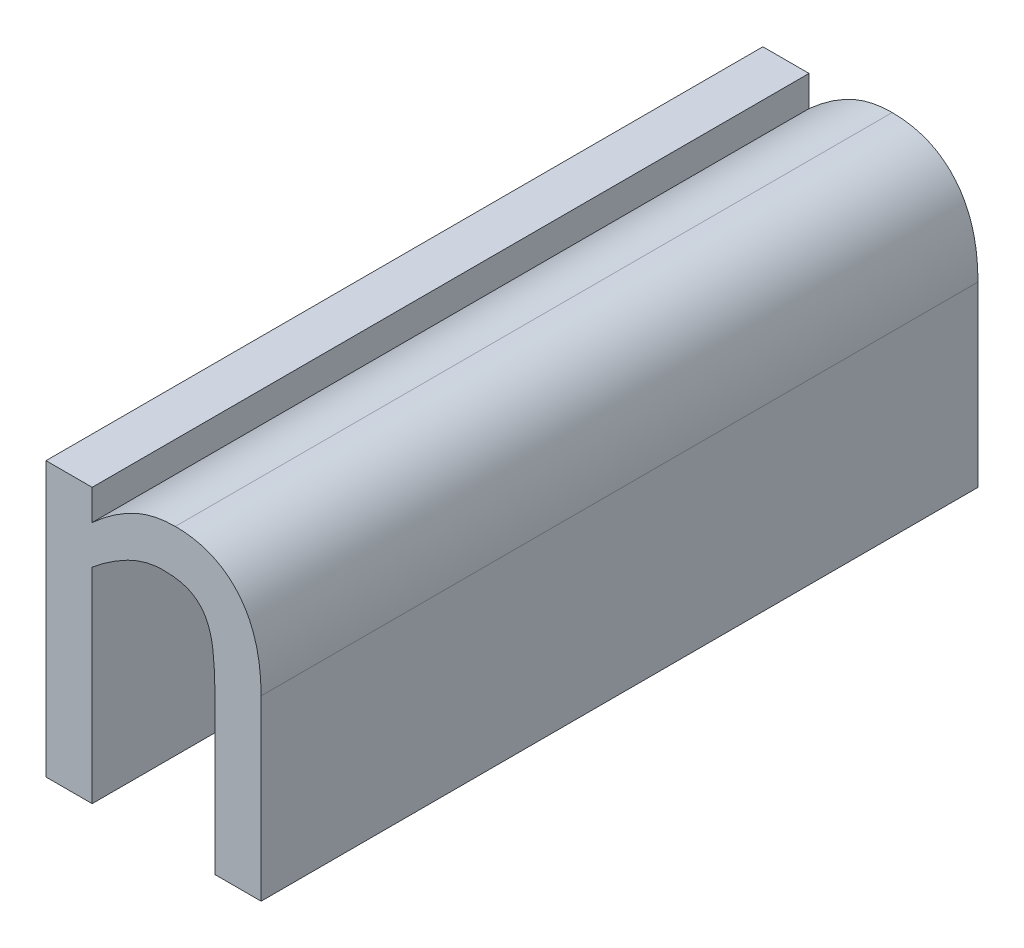
ISO-10303-21;
HEADER;
FILE_DESCRIPTION(('STEP AP214'),'2;1');
FILE_NAME('part.step','',(''),(''),'','','');
FILE_SCHEMA(('AUTOMOTIVE_DESIGN { 1 0 10303 214 1 1 1 1 }'));
ENDSEC;
DATA;
#1=APPLICATION_CONTEXT('core data for automotive mechanical design processes');
#2=APPLICATION_PROTOCOL_DEFINITION('international standard','automotive_design',2000,#1);
#3=PRODUCT_CONTEXT('',#1,'mechanical');
#4=PRODUCT('Part','Part','',(#3));
#5=PRODUCT_RELATED_PRODUCT_CATEGORY('part','',(#4));
#6=PRODUCT_DEFINITION_FORMATION('','',#4);
#7=PRODUCT_DEFINITION_CONTEXT('part definition',#1,'design');
#8=PRODUCT_DEFINITION('design','',#6,#7);
#9=PRODUCT_DEFINITION_SHAPE('','',#8);
#10=(LENGTH_UNIT() NAMED_UNIT(*) SI_UNIT(.MILLI.,.METRE.));
#11=(NAMED_UNIT(*) PLANE_ANGLE_UNIT() SI_UNIT($,.RADIAN.));
#12=(NAMED_UNIT(*) SI_UNIT($,.STERADIAN.) SOLID_ANGLE_UNIT());
#13=UNCERTAINTY_MEASURE_WITH_UNIT(LENGTH_MEASURE(1.E-05),#10,'distance_accuracy_value','');
#14=(GEOMETRIC_REPRESENTATION_CONTEXT(3) GLOBAL_UNCERTAINTY_ASSIGNED_CONTEXT((#13)) GLOBAL_UNIT_ASSIGNED_CONTEXT((#10,
#11,#12)) REPRESENTATION_CONTEXT('',''));
#15=CARTESIAN_POINT('',(0.,0.,0.));
#16=DIRECTION('',(0.,0.,1.));
#17=DIRECTION('',(1.,0.,0.));
#18=AXIS2_PLACEMENT_3D('',#15,#16,#17);
#19=CARTESIAN_POINT('',(-1.705287300423,-1.884092758713,0.));
#20=DIRECTION('',(-1.,0.,0.));
#21=DIRECTION('',(0.,-1.,0.));
#22=AXIS2_PLACEMENT_3D('',#19,#20,#21);
#23=PLANE('',#22);
#24=DIRECTION('',(0.,1.,0.));
#25=VECTOR('',#24,1.);
#26=CARTESIAN_POINT('',(-1.705287300423,-1.905886879973,0.));
#27=LINE('',#26,#25);
#28=CARTESIAN_POINT('',(-1.705287300423,-1.905886879973,0.));
#29=VERTEX_POINT('',#28);
#30=CARTESIAN_POINT('',(-1.705287300423,-1.884092758713,0.));
#31=VERTEX_POINT('',#30);
#32=EDGE_CURVE('E11',#29,#31,#27,.T.);
#33=ORIENTED_EDGE('',*,*,#32,.F.);
#34=DIRECTION('',(0.,0.,1.));
#35=VECTOR('',#34,1.);
#36=CARTESIAN_POINT('',(-1.705287300423,-1.905886879973,0.));
#37=LINE('',#36,#35);
#38=CARTESIAN_POINT('',(-1.705287300423,-1.905886879973,0.1));
#39=VERTEX_POINT('',#38);
#40=EDGE_CURVE('E24',#29,#39,#37,.T.);
#41=ORIENTED_EDGE('',*,*,#40,.T.);
#42=DIRECTION('',(0.,-1.,0.));
#43=VECTOR('',#42,1.);
#44=CARTESIAN_POINT('',(-1.705287300423,-1.905886879973,0.1));
#45=LINE('',#44,#43);
#46=CARTESIAN_POINT('',(-1.705287300423,-1.884092758713,0.1));
#47=VERTEX_POINT('',#46);
#48=EDGE_CURVE('E130',#47,#39,#45,.T.);
#49=ORIENTED_EDGE('',*,*,#48,.F.);
#50=DIRECTION('',(0.,0.,1.));
#51=VECTOR('',#50,1.);
#52=CARTESIAN_POINT('',(-1.705287300423,-1.884092758713,0.));
#53=LINE('',#52,#51);
#54=EDGE_CURVE('E258',#31,#47,#53,.T.);
#55=ORIENTED_EDGE('',*,*,#54,.F.);
#56=EDGE_LOOP('',(#33,#41,#49,#55));
#57=FACE_BOUND('',#56,.T.);
#58=ADVANCED_FACE('F17',(#57),#23,.T.);
#59=CARTESIAN_POINT('',(-1.706525602768,-1.875548472538,0.));
#60=CARTESIAN_POINT('',(-1.706525602768,-1.875548472538,0.1));
#61=CARTESIAN_POINT('',(-1.705782621361,-1.876910605116,0.));
#62=CARTESIAN_POINT('',(-1.705782621361,-1.876910605116,0.1));
#63=CARTESIAN_POINT('',(-1.705287300423,-1.881451047045,0.));
#64=CARTESIAN_POINT('',(-1.705287300423,-1.881451047045,0.1));
#65=CARTESIAN_POINT('',(-1.705287300423,-1.884092758713,0.));
#66=CARTESIAN_POINT('',(-1.705287300423,-1.884092758713,0.1));
#67=B_SPLINE_SURFACE_WITH_KNOTS('',2,1,((#59,#60),(#61,#62),(#63,#64),(#65,#66)),.UNSPECIFIED.,
.F.,.F.,.F.,(3,1,3),(2,2),(-2.,-1.,0.),(0.,0.01),.UNSPECIFIED.);
#68=CARTESIAN_POINT('',(-1.705287300423,-1.884092758713,0.));
#69=CARTESIAN_POINT('',(-1.705287300423,-1.881451047045,0.));
#70=CARTESIAN_POINT('',(-1.705782621361,-1.876910605116,0.));
#71=CARTESIAN_POINT('',(-1.706525602768,-1.875548472538,0.));
#72=B_SPLINE_CURVE_WITH_KNOTS('',2,(#68,#69,#70,#71),.UNSPECIFIED.,.F.,.F.,(3,1,3),(0.,1.,2.),.UNSPECIFIED.);
#73=CARTESIAN_POINT('',(-1.706525602768,-1.875548472538,0.));
#74=VERTEX_POINT('',#73);
#75=EDGE_CURVE('E251',#31,#74,#72,.T.);
#76=CARTESIAN_POINT('',(-1.706525602768,-1.875548472538,0.1));
#77=CARTESIAN_POINT('',(-1.705782621361,-1.876910605116,0.1));
#78=CARTESIAN_POINT('',(-1.705287300423,-1.881451047045,0.1));
#79=CARTESIAN_POINT('',(-1.705287300423,-1.884092758713,0.1));
#80=B_SPLINE_CURVE_WITH_KNOTS('',2,(#76,#77,#78,#79),.UNSPECIFIED.,.F.,.F.,(3,1,3),(-2.,-1.,0.),.UNSPECIFIED.);
#81=CARTESIAN_POINT('',(-1.706525602768,-1.875548472538,0.1));
#82=VERTEX_POINT('',#81);
#83=EDGE_CURVE('E247',#82,#47,#80,.T.);
#84=DIRECTION('',(0.,0.,1.));
#85=VECTOR('',#84,1.);
#86=CARTESIAN_POINT('',(-1.706525602768,-1.875548472538,0.));
#87=LINE('',#86,#85);
#88=EDGE_CURVE('E241',#74,#82,#87,.T.);
#89=ORIENTED_EDGE('',*,*,#75,.F.);
#90=ORIENTED_EDGE('',*,*,#54,.T.);
#91=ORIENTED_EDGE('',*,*,#83,.F.);
#92=ORIENTED_EDGE('',*,*,#88,.F.);
#93=EDGE_LOOP('',(#89,#90,#91,#92));
#94=FACE_BOUND('',#93,.T.);
#95=ADVANCED_FACE('F303',(#94),#67,.T.);
#96=CARTESIAN_POINT('',(-1.712510730765,-1.872700377146,0.));
#97=CARTESIAN_POINT('',(-1.712510730765,-1.872700377146,0.1));
#98=CARTESIAN_POINT('',(-1.710116679566,-1.872700377146,0.));
#99=CARTESIAN_POINT('',(-1.710116679566,-1.872700377146,0.1));
#100=CARTESIAN_POINT('',(-1.707309860919,-1.874103786469,0.));
#101=CARTESIAN_POINT('',(-1.707309860919,-1.874103786469,0.1));
#102=CARTESIAN_POINT('',(-1.706525602768,-1.875548472538,0.));
#103=CARTESIAN_POINT('',(-1.706525602768,-1.875548472538,0.1));
#104=B_SPLINE_SURFACE_WITH_KNOTS('',2,1,((#96,#97),(#98,#99),(#100,#101),(#102,#103)),
.UNSPECIFIED.,.F.,.F.,.F.,(3,1,3),(2,2),(-2.,-1.,0.),(0.,0.01),.UNSPECIFIED.);
#105=CARTESIAN_POINT('',(-1.706525602768,-1.875548472538,0.));
#106=CARTESIAN_POINT('',(-1.707309860919,-1.874103786469,0.));
#107=CARTESIAN_POINT('',(-1.710116679566,-1.872700377146,0.));
#108=CARTESIAN_POINT('',(-1.712510730765,-1.872700377146,0.));
#109=B_SPLINE_CURVE_WITH_KNOTS('',2,(#105,#106,#107,#108),.UNSPECIFIED.,.F.,.F.,(3,1,3),(0.,1.,
2.),.UNSPECIFIED.);
#110=CARTESIAN_POINT('',(-1.712510730765,-1.872700377146,0.));
#111=VERTEX_POINT('',#110);
#112=EDGE_CURVE('E234',#74,#111,#109,.T.);
#113=CARTESIAN_POINT('',(-1.712510730765,-1.872700377146,0.1));
#114=CARTESIAN_POINT('',(-1.710116679566,-1.872700377146,0.1));
#115=CARTESIAN_POINT('',(-1.707309860919,-1.874103786469,0.1));
#116=CARTESIAN_POINT('',(-1.706525602768,-1.875548472538,0.1));
#117=B_SPLINE_CURVE_WITH_KNOTS('',2,(#113,#114,#115,#116),.UNSPECIFIED.,.F.,.F.,(3,1,3),(-2.,
-1.,0.),.UNSPECIFIED.);
#118=CARTESIAN_POINT('',(-1.712510730765,-1.872700377146,0.1));
#119=VERTEX_POINT('',#118);
#120=EDGE_CURVE('E229',#119,#82,#117,.T.);
#121=DIRECTION('',(0.,0.,1.));
#122=VECTOR('',#121,1.);
#123=CARTESIAN_POINT('',(-1.712510730765,-1.872700377146,0.));
#124=LINE('',#123,#122);
#125=EDGE_CURVE('E223',#111,#119,#124,.T.);
#126=ORIENTED_EDGE('',*,*,#112,.F.);
#127=ORIENTED_EDGE('',*,*,#88,.T.);
#128=ORIENTED_EDGE('',*,*,#120,.F.);
#129=ORIENTED_EDGE('',*,*,#125,.F.);
#130=EDGE_LOOP('',(#126,#127,#128,#129));
#131=FACE_BOUND('',#130,.T.);
#132=ADVANCED_FACE('F299',(#131),#104,.T.);
#133=CARTESIAN_POINT('',(-1.722417149519,-1.877323372564,0.));
#134=CARTESIAN_POINT('',(-1.722417149519,-1.877323372564,0.1));
#135=CARTESIAN_POINT('',(-1.719981821576,-1.875259535324,0.));
#136=CARTESIAN_POINT('',(-1.719981821576,-1.875259535324,0.1));
#137=CARTESIAN_POINT('',(-1.714904781964,-1.872700377146,0.));
#138=CARTESIAN_POINT('',(-1.714904781964,-1.872700377146,0.1));
#139=CARTESIAN_POINT('',(-1.712510730765,-1.872700377146,0.));
#140=CARTESIAN_POINT('',(-1.712510730765,-1.872700377146,0.1));
#141=B_SPLINE_SURFACE_WITH_KNOTS('',2,1,((#133,#134),(#135,#136),(#137,#138),(#139,#140)),
.UNSPECIFIED.,.F.,.F.,.F.,(3,1,3),(2,2),(-2.,-1.,0.),(0.,0.01),.UNSPECIFIED.);
#142=CARTESIAN_POINT('',(-1.712510730765,-1.872700377146,0.));
#143=CARTESIAN_POINT('',(-1.714904781964,-1.872700377146,0.));
#144=CARTESIAN_POINT('',(-1.719981821576,-1.875259535324,0.));
#145=CARTESIAN_POINT('',(-1.722417149519,-1.877323372564,0.));
#146=B_SPLINE_CURVE_WITH_KNOTS('',2,(#142,#143,#144,#145),.UNSPECIFIED.,.F.,.F.,(3,1,3),(0.,1.,
2.),.UNSPECIFIED.);
#147=CARTESIAN_POINT('',(-1.722417149519,-1.877323372564,0.));
#148=VERTEX_POINT('',#147);
#149=EDGE_CURVE('E216',#111,#148,#146,.T.);
#150=CARTESIAN_POINT('',(-1.722417149519,-1.877323372564,0.1));
#151=CARTESIAN_POINT('',(-1.719981821576,-1.875259535324,0.1));
#152=CARTESIAN_POINT('',(-1.714904781964,-1.872700377146,0.1));
#153=CARTESIAN_POINT('',(-1.712510730765,-1.872700377146,0.1));
#154=B_SPLINE_CURVE_WITH_KNOTS('',2,(#150,#151,#152,#153),.UNSPECIFIED.,.F.,.F.,(3,1,3),(-2.,
-1.,0.),.UNSPECIFIED.);
#155=CARTESIAN_POINT('',(-1.722417149519,-1.877323372564,0.1));
#156=VERTEX_POINT('',#155);
#157=EDGE_CURVE('E211',#156,#119,#154,.T.);
#158=DIRECTION('',(0.,0.,1.));
#159=VECTOR('',#158,1.);
#160=CARTESIAN_POINT('',(-1.722417149519,-1.877323372564,0.));
#161=LINE('',#160,#159);
#162=EDGE_CURVE('E208',#148,#156,#161,.T.);
#163=ORIENTED_EDGE('',*,*,#149,.F.);
#164=ORIENTED_EDGE('',*,*,#125,.T.);
#165=ORIENTED_EDGE('',*,*,#157,.F.);
#166=ORIENTED_EDGE('',*,*,#162,.F.);
#167=EDGE_LOOP('',(#163,#164,#165,#166));
#168=FACE_BOUND('',#167,.T.);
#169=ADVANCED_FACE('F295',(#168),#141,.T.);
#170=CARTESIAN_POINT('',(-1.722417149519,-1.905886879973,0.));
#171=DIRECTION('',(1.,0.,0.));
#172=DIRECTION('',(0.,1.,0.));
#173=AXIS2_PLACEMENT_3D('',#170,#171,#172);
#174=PLANE('',#173);
#175=DIRECTION('',(0.,-1.,0.));
#176=VECTOR('',#175,1.);
#177=CARTESIAN_POINT('',(-1.722417149519,-1.877323372564,0.));
#178=LINE('',#177,#176);
#179=CARTESIAN_POINT('',(-1.722417149519,-1.905886879973,0.));
#180=VERTEX_POINT('',#179);
#181=EDGE_CURVE('E206',#148,#180,#178,.T.);
#182=ORIENTED_EDGE('',*,*,#181,.F.);
#183=ORIENTED_EDGE('',*,*,#162,.T.);
#184=DIRECTION('',(0.,1.,0.));
#185=VECTOR('',#184,1.);
#186=CARTESIAN_POINT('',(-1.722417149519,-1.877323372564,0.1));
#187=LINE('',#186,#185);
#188=CARTESIAN_POINT('',(-1.722417149519,-1.905886879973,0.1));
#189=VERTEX_POINT('',#188);
#190=EDGE_CURVE('E203',#189,#156,#187,.T.);
#191=ORIENTED_EDGE('',*,*,#190,.F.);
#192=DIRECTION('',(0.,0.,1.));
#193=VECTOR('',#192,1.);
#194=CARTESIAN_POINT('',(-1.722417149519,-1.905886879973,0.));
#195=LINE('',#194,#193);
#196=EDGE_CURVE('E200',#180,#189,#195,.T.);
#197=ORIENTED_EDGE('',*,*,#196,.F.);
#198=EDGE_LOOP('',(#182,#183,#191,#197));
#199=FACE_BOUND('',#198,.T.);
#200=ADVANCED_FACE('F291',(#199),#174,.T.);
#201=CARTESIAN_POINT('',(-1.72885632171,-1.905886879973,0.));
#202=DIRECTION('',(0.,-1.,0.));
#203=DIRECTION('',(1.,0.,0.));
#204=AXIS2_PLACEMENT_3D('',#201,#202,#203);
#205=PLANE('',#204);
#206=DIRECTION('',(-1.,0.,0.));
#207=VECTOR('',#206,1.);
#208=CARTESIAN_POINT('',(-1.722417149519,-1.905886879973,0.));
#209=LINE('',#208,#207);
#210=CARTESIAN_POINT('',(-1.72885632171,-1.905886879973,0.));
#211=VERTEX_POINT('',#210);
#212=EDGE_CURVE('E198',#180,#211,#209,.T.);
#213=ORIENTED_EDGE('',*,*,#212,.F.);
#214=ORIENTED_EDGE('',*,*,#196,.T.);
#215=DIRECTION('',(1.,0.,0.));
#216=VECTOR('',#215,1.);
#217=CARTESIAN_POINT('',(-1.722417149519,-1.905886879973,0.1));
#218=LINE('',#217,#216);
#219=CARTESIAN_POINT('',(-1.72885632171,-1.905886879973,0.1));
#220=VERTEX_POINT('',#219);
#221=EDGE_CURVE('E195',#220,#189,#218,.T.);
#222=ORIENTED_EDGE('',*,*,#221,.F.);
#223=DIRECTION('',(0.,0.,1.));
#224=VECTOR('',#223,1.);
#225=CARTESIAN_POINT('',(-1.72885632171,-1.905886879973,0.));
#226=LINE('',#225,#224);
#227=EDGE_CURVE('E192',#211,#220,#226,.T.);
#228=ORIENTED_EDGE('',*,*,#227,.F.);
#229=EDGE_LOOP('',(#213,#214,#222,#228));
#230=FACE_BOUND('',#229,.T.);
#231=ADVANCED_FACE('F287',(#230),#205,.T.);
#232=CARTESIAN_POINT('',(-1.72885632171,-1.867664614279,0.));
#233=DIRECTION('',(-1.,0.,0.));
#234=DIRECTION('',(0.,-1.,0.));
#235=AXIS2_PLACEMENT_3D('',#232,#233,#234);
#236=PLANE('',#235);
#237=DIRECTION('',(0.,1.,0.));
#238=VECTOR('',#237,1.);
#239=CARTESIAN_POINT('',(-1.72885632171,-1.905886879973,0.));
#240=LINE('',#239,#238);
#241=CARTESIAN_POINT('',(-1.72885632171,-1.867664614279,0.));
#242=VERTEX_POINT('',#241);
#243=EDGE_CURVE('E190',#211,#242,#240,.T.);
#244=ORIENTED_EDGE('',*,*,#243,.F.);
#245=ORIENTED_EDGE('',*,*,#227,.T.);
#246=DIRECTION('',(0.,-1.,0.));
#247=VECTOR('',#246,1.);
#248=CARTESIAN_POINT('',(-1.72885632171,-1.905886879973,0.1));
#249=LINE('',#248,#247);
#250=CARTESIAN_POINT('',(-1.72885632171,-1.867664614279,0.1));
#251=VERTEX_POINT('',#250);
#252=EDGE_CURVE('E187',#251,#220,#249,.T.);
#253=ORIENTED_EDGE('',*,*,#252,.F.);
#254=DIRECTION('',(0.,0.,1.));
#255=VECTOR('',#254,1.);
#256=CARTESIAN_POINT('',(-1.72885632171,-1.867664614279,0.));
#257=LINE('',#256,#255);
#258=EDGE_CURVE('E184',#242,#251,#257,.T.);
#259=ORIENTED_EDGE('',*,*,#258,.F.);
#260=EDGE_LOOP('',(#244,#245,#253,#259));
#261=FACE_BOUND('',#260,.T.);
#262=ADVANCED_FACE('F283',(#261),#236,.T.);
#263=CARTESIAN_POINT('',(-1.722417149519,-1.867664614279,0.));
#264=DIRECTION('',(0.,1.,0.));
#265=DIRECTION('',(-1.,0.,0.));
#266=AXIS2_PLACEMENT_3D('',#263,#264,#265);
#267=PLANE('',#266);
#268=DIRECTION('',(1.,0.,0.));
#269=VECTOR('',#268,1.);
#270=CARTESIAN_POINT('',(-1.72885632171,-1.867664614279,0.));
#271=LINE('',#270,#269);
#272=CARTESIAN_POINT('',(-1.722417149519,-1.867664614279,0.));
#273=VERTEX_POINT('',#272);
#274=EDGE_CURVE('E182',#242,#273,#271,.T.);
#275=ORIENTED_EDGE('',*,*,#274,.F.);
#276=ORIENTED_EDGE('',*,*,#258,.T.);
#277=DIRECTION('',(-1.,0.,0.));
#278=VECTOR('',#277,1.);
#279=CARTESIAN_POINT('',(-1.72885632171,-1.867664614279,0.1));
#280=LINE('',#279,#278);
#281=CARTESIAN_POINT('',(-1.722417149519,-1.867664614279,0.1));
#282=VERTEX_POINT('',#281);
#283=EDGE_CURVE('E179',#282,#251,#280,.T.);
#284=ORIENTED_EDGE('',*,*,#283,.F.);
#285=DIRECTION('',(0.,0.,1.));
#286=VECTOR('',#285,1.);
#287=CARTESIAN_POINT('',(-1.722417149519,-1.867664614279,0.));
#288=LINE('',#287,#286);
#289=EDGE_CURVE('E176',#273,#282,#288,.T.);
#290=ORIENTED_EDGE('',*,*,#289,.F.);
#291=EDGE_LOOP('',(#275,#276,#284,#290));
#292=FACE_BOUND('',#291,.T.);
#293=ADVANCED_FACE('F279',(#292),#267,.T.);
#294=CARTESIAN_POINT('',(-1.722417149519,-1.871916118994,0.));
#295=DIRECTION('',(1.,0.,0.));
#296=DIRECTION('',(0.,1.,0.));
#297=AXIS2_PLACEMENT_3D('',#294,#295,#296);
#298=PLANE('',#297);
#299=DIRECTION('',(0.,-1.,0.));
#300=VECTOR('',#299,1.);
#301=CARTESIAN_POINT('',(-1.722417149519,-1.867664614279,0.));
#302=LINE('',#301,#300);
#303=CARTESIAN_POINT('',(-1.722417149519,-1.871916118994,0.));
#304=VERTEX_POINT('',#303);
#305=EDGE_CURVE('E174',#273,#304,#302,.T.);
#306=ORIENTED_EDGE('',*,*,#305,.F.);
#307=ORIENTED_EDGE('',*,*,#289,.T.);
#308=DIRECTION('',(0.,1.,0.));
#309=VECTOR('',#308,1.);
#310=CARTESIAN_POINT('',(-1.722417149519,-1.867664614279,0.1));
#311=LINE('',#310,#309);
#312=CARTESIAN_POINT('',(-1.722417149519,-1.871916118994,0.1));
#313=VERTEX_POINT('',#312);
#314=EDGE_CURVE('E171',#313,#282,#311,.T.);
#315=ORIENTED_EDGE('',*,*,#314,.F.);
#316=DIRECTION('',(0.,0.,1.));
#317=VECTOR('',#316,1.);
#318=CARTESIAN_POINT('',(-1.722417149519,-1.871916118994,0.));
#319=LINE('',#318,#317);
#320=EDGE_CURVE('E165',#304,#313,#319,.T.);
#321=ORIENTED_EDGE('',*,*,#320,.F.);
#322=EDGE_LOOP('',(#306,#307,#315,#321));
#323=FACE_BOUND('',#322,.T.);
#324=ADVANCED_FACE('F275',(#323),#298,.T.);
#325=CARTESIAN_POINT('',(-1.710818384228,-1.866591418914,0.));
#326=CARTESIAN_POINT('',(-1.710818384228,-1.866591418914,0.1));
#327=CARTESIAN_POINT('',(-1.713955416833,-1.866591418914,0.));
#328=CARTESIAN_POINT('',(-1.713955416833,-1.866591418914,0.1));
#329=CARTESIAN_POINT('',(-1.719527777383,-1.869315684071,0.));
#330=CARTESIAN_POINT('',(-1.719527777383,-1.869315684071,0.1));
#331=CARTESIAN_POINT('',(-1.722417149519,-1.871916118994,0.));
#332=CARTESIAN_POINT('',(-1.722417149519,-1.871916118994,0.1));
#333=B_SPLINE_SURFACE_WITH_KNOTS('',2,1,((#325,#326),(#327,#328),(#329,#330),(#331,#332)),
.UNSPECIFIED.,.F.,.F.,.F.,(3,1,3),(2,2),(-2.,-1.,0.),(0.,0.01),.UNSPECIFIED.);
#334=CARTESIAN_POINT('',(-1.722417149519,-1.871916118994,0.));
#335=CARTESIAN_POINT('',(-1.719527777383,-1.869315684071,0.));
#336=CARTESIAN_POINT('',(-1.713955416833,-1.866591418914,0.));
#337=CARTESIAN_POINT('',(-1.710818384228,-1.866591418914,0.));
#338=B_SPLINE_CURVE_WITH_KNOTS('',2,(#334,#335,#336,#337),.UNSPECIFIED.,.F.,.F.,(3,1,3),(0.,1.,
2.),.UNSPECIFIED.);
#339=CARTESIAN_POINT('',(-1.710818384228,-1.866591418914,0.));
#340=VERTEX_POINT('',#339);
#341=EDGE_CURVE('E158',#304,#340,#338,.T.);
#342=CARTESIAN_POINT('',(-1.710818384228,-1.866591418914,0.1));
#343=CARTESIAN_POINT('',(-1.713955416833,-1.866591418914,0.1));
#344=CARTESIAN_POINT('',(-1.719527777383,-1.869315684071,0.1));
#345=CARTESIAN_POINT('',(-1.722417149519,-1.871916118994,0.1));
#346=B_SPLINE_CURVE_WITH_KNOTS('',2,(#342,#343,#344,#345),.UNSPECIFIED.,.F.,.F.,(3,1,3),(-2.,
-1.,0.),.UNSPECIFIED.);
#347=CARTESIAN_POINT('',(-1.710818384228,-1.866591418914,0.1));
#348=VERTEX_POINT('',#347);
#349=EDGE_CURVE('E153',#348,#313,#346,.T.);
#350=DIRECTION('',(0.,0.,1.));
#351=VECTOR('',#350,1.);
#352=CARTESIAN_POINT('',(-1.710818384228,-1.866591418914,0.));
#353=LINE('',#352,#351);
#354=EDGE_CURVE('E147',#340,#348,#353,.T.);
#355=ORIENTED_EDGE('',*,*,#341,.F.);
#356=ORIENTED_EDGE('',*,*,#320,.T.);
#357=ORIENTED_EDGE('',*,*,#349,.F.);
#358=ORIENTED_EDGE('',*,*,#354,.F.);
#359=EDGE_LOOP('',(#355,#356,#357,#358));
#360=FACE_BOUND('',#359,.T.);
#361=ADVANCED_FACE('F271',(#360),#333,.T.);
#362=CARTESIAN_POINT('',(-1.698848128233,-1.881079556342,0.));
#363=CARTESIAN_POINT('',(-1.698848128233,-1.881079556342,0.1));
#364=CARTESIAN_POINT('',(-1.698848128233,-1.87402123298,0.));
#365=CARTESIAN_POINT('',(-1.698848128233,-1.87402123298,0.1));
#366=CARTESIAN_POINT('',(-1.705204746934,-1.866591418914,0.));
#367=CARTESIAN_POINT('',(-1.705204746934,-1.866591418914,0.1));
#368=CARTESIAN_POINT('',(-1.710818384228,-1.866591418914,0.));
#369=CARTESIAN_POINT('',(-1.710818384228,-1.866591418914,0.1));
#370=B_SPLINE_SURFACE_WITH_KNOTS('',2,1,((#362,#363),(#364,#365),(#366,#367),(#368,#369)),
.UNSPECIFIED.,.F.,.F.,.F.,(3,1,3),(2,2),(-2.,-1.,0.),(0.,0.01),.UNSPECIFIED.);
#371=CARTESIAN_POINT('',(-1.710818384228,-1.866591418914,0.));
#372=CARTESIAN_POINT('',(-1.705204746934,-1.866591418914,0.));
#373=CARTESIAN_POINT('',(-1.698848128233,-1.87402123298,0.));
#374=CARTESIAN_POINT('',(-1.698848128233,-1.881079556342,0.));
#375=B_SPLINE_CURVE_WITH_KNOTS('',2,(#371,#372,#373,#374),.UNSPECIFIED.,.F.,.F.,(3,1,3),(0.,1.,
2.),.UNSPECIFIED.);
#376=CARTESIAN_POINT('',(-1.698848128233,-1.881079556342,0.));
#377=VERTEX_POINT('',#376);
#378=EDGE_CURVE('E140',#340,#377,#375,.T.);
#379=CARTESIAN_POINT('',(-1.698848128233,-1.881079556342,0.1));
#380=CARTESIAN_POINT('',(-1.698848128233,-1.87402123298,0.1));
#381=CARTESIAN_POINT('',(-1.705204746934,-1.866591418914,0.1));
#382=CARTESIAN_POINT('',(-1.710818384228,-1.866591418914,0.1));
#383=B_SPLINE_CURVE_WITH_KNOTS('',2,(#379,#380,#381,#382),.UNSPECIFIED.,.F.,.F.,(3,1,3),(-2.,
-1.,0.),.UNSPECIFIED.);
#384=CARTESIAN_POINT('',(-1.698848128233,-1.881079556342,0.1));
#385=VERTEX_POINT('',#384);
#386=EDGE_CURVE('E136',#385,#348,#383,.T.);
#387=DIRECTION('',(0.,0.,1.));
#388=VECTOR('',#387,1.);
#389=CARTESIAN_POINT('',(-1.698848128233,-1.881079556342,0.));
#390=LINE('',#389,#388);
#391=EDGE_CURVE('E115',#377,#385,#390,.T.);
#392=ORIENTED_EDGE('',*,*,#378,.F.);
#393=ORIENTED_EDGE('',*,*,#354,.T.);
#394=ORIENTED_EDGE('',*,*,#386,.F.);
#395=ORIENTED_EDGE('',*,*,#391,.F.);
#396=EDGE_LOOP('',(#392,#393,#394,#395));
#397=FACE_BOUND('',#396,.T.);
#398=ADVANCED_FACE('F269',(#397),#370,.T.);
#399=CARTESIAN_POINT('',(-1.698848128233,-1.905886879973,0.));
#400=DIRECTION('',(1.,0.,0.));
#401=DIRECTION('',(0.,1.,0.));
#402=AXIS2_PLACEMENT_3D('',#399,#400,#401);
#403=PLANE('',#402);
#404=DIRECTION('',(0.,-1.,0.));
#405=VECTOR('',#404,1.);
#406=CARTESIAN_POINT('',(-1.698848128233,-1.881079556342,0.));
#407=LINE('',#406,#405);
#408=CARTESIAN_POINT('',(-1.698848128233,-1.905886879973,0.));
#409=VERTEX_POINT('',#408);
#410=EDGE_CURVE('E119',#377,#409,#407,.T.);
#411=ORIENTED_EDGE('',*,*,#410,.F.);
#412=ORIENTED_EDGE('',*,*,#391,.T.);
#413=DIRECTION('',(0.,1.,0.));
#414=VECTOR('',#413,1.);
#415=CARTESIAN_POINT('',(-1.698848128233,-1.881079556342,0.1));
#416=LINE('',#415,#414);
#417=CARTESIAN_POINT('',(-1.698848128233,-1.905886879973,0.1));
#418=VERTEX_POINT('',#417);
#419=EDGE_CURVE('E108',#418,#385,#416,.T.);
#420=ORIENTED_EDGE('',*,*,#419,.F.);
#421=DIRECTION('',(0.,0.,1.));
#422=VECTOR('',#421,1.);
#423=CARTESIAN_POINT('',(-1.698848128233,-1.905886879973,0.));
#424=LINE('',#423,#422);
#425=EDGE_CURVE('E112',#409,#418,#424,.T.);
#426=ORIENTED_EDGE('',*,*,#425,.F.);
#427=EDGE_LOOP('',(#411,#412,#420,#426));
#428=FACE_BOUND('',#427,.T.);
#429=ADVANCED_FACE('F111',(#428),#403,.T.);
#430=CARTESIAN_POINT('',(-1.705287300423,-1.905886879973,0.));
#431=DIRECTION('',(0.,-1.,0.));
#432=DIRECTION('',(1.,0.,0.));
#433=AXIS2_PLACEMENT_3D('',#430,#431,#432);
#434=PLANE('',#433);
#435=DIRECTION('',(-1.,0.,0.));
#436=VECTOR('',#435,1.);
#437=CARTESIAN_POINT('',(-1.698848128233,-1.905886879973,0.));
#438=LINE('',#437,#436);
#439=EDGE_CURVE('E125',#409,#29,#438,.T.);
#440=ORIENTED_EDGE('',*,*,#439,.F.);
#441=ORIENTED_EDGE('',*,*,#425,.T.);
#442=DIRECTION('',(1.,0.,0.));
#443=VECTOR('',#442,1.);
#444=CARTESIAN_POINT('',(-1.698848128233,-1.905886879973,0.1));
#445=LINE('',#444,#443);
#446=EDGE_CURVE('E124',#39,#418,#445,.T.);
#447=ORIENTED_EDGE('',*,*,#446,.F.);
#448=ORIENTED_EDGE('',*,*,#40,.F.);
#449=EDGE_LOOP('',(#440,#441,#447,#448));
#450=FACE_BOUND('',#449,.T.);
#451=ADVANCED_FACE('F123',(#450),#434,.T.);
#452=CARTESIAN_POINT('',(-1.714824194619,-1.886223602894,0.));
#453=DIRECTION('',(0.,0.,1.));
#454=DIRECTION('',(1.,0.,0.));
#455=AXIS2_PLACEMENT_3D('',#452,#453,#454);
#456=PLANE('',#455);
#457=ORIENTED_EDGE('',*,*,#439,.T.);
#458=ORIENTED_EDGE('',*,*,#32,.T.);
#459=ORIENTED_EDGE('',*,*,#75,.T.);
#460=ORIENTED_EDGE('',*,*,#112,.T.);
#461=ORIENTED_EDGE('',*,*,#149,.T.);
#462=ORIENTED_EDGE('',*,*,#181,.T.);
#463=ORIENTED_EDGE('',*,*,#212,.T.);
#464=ORIENTED_EDGE('',*,*,#243,.T.);
#465=ORIENTED_EDGE('',*,*,#274,.T.);
#466=ORIENTED_EDGE('',*,*,#305,.T.);
#467=ORIENTED_EDGE('',*,*,#341,.T.);
#468=ORIENTED_EDGE('',*,*,#378,.T.);
#469=ORIENTED_EDGE('',*,*,#410,.T.);
#470=EDGE_LOOP('',(#457,#458,#459,#460,#461,#462,#463,#464,#465,#466,#467,#468,#469));
#471=FACE_BOUND('',#470,.T.);
#472=ADVANCED_FACE('F264',(#471),#456,.F.);
#473=CARTESIAN_POINT('',(-1.714824194619,-1.886223602894,0.1));
#474=DIRECTION('',(0.,0.,1.));
#475=DIRECTION('',(1.,0.,0.));
#476=AXIS2_PLACEMENT_3D('',#473,#474,#475);
#477=PLANE('',#476);
#478=ORIENTED_EDGE('',*,*,#446,.T.);
#479=ORIENTED_EDGE('',*,*,#419,.T.);
#480=ORIENTED_EDGE('',*,*,#386,.T.);
#481=ORIENTED_EDGE('',*,*,#349,.T.);
#482=ORIENTED_EDGE('',*,*,#314,.T.);
#483=ORIENTED_EDGE('',*,*,#283,.T.);
#484=ORIENTED_EDGE('',*,*,#252,.T.);
#485=ORIENTED_EDGE('',*,*,#221,.T.);
#486=ORIENTED_EDGE('',*,*,#190,.T.);
#487=ORIENTED_EDGE('',*,*,#157,.T.);
#488=ORIENTED_EDGE('',*,*,#120,.T.);
#489=ORIENTED_EDGE('',*,*,#83,.T.);
#490=ORIENTED_EDGE('',*,*,#48,.T.);
#491=EDGE_LOOP('',(#478,#479,#480,#481,#482,#483,#484,#485,#486,#487,#488,#489,#490));
#492=FACE_BOUND('',#491,.T.);
#493=ADVANCED_FACE('F128',(#492),#477,.T.);
#494=CLOSED_SHELL('',(#58,#95,#132,#169,#200,#231,#262,#293,#324,#361,#398,#429,#451,#472,#493));
#495=MANIFOLD_SOLID_BREP('B1',#494);
#496=ADVANCED_BREP_SHAPE_REPRESENTATION('',(#18,#495),#14);
#497=SHAPE_DEFINITION_REPRESENTATION(#9,#496);
ENDSEC;
END-ISO-10303-21;
